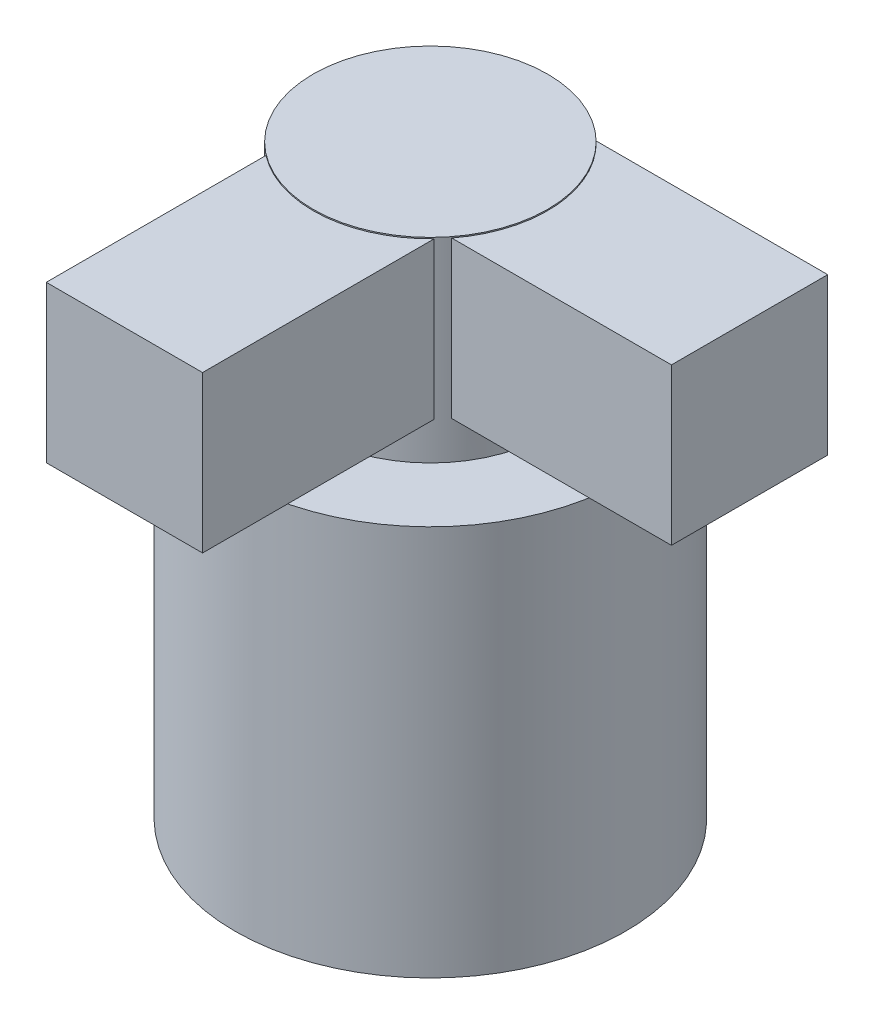
ISO-10303-21;
HEADER;
FILE_DESCRIPTION(('STEP AP214'),'2;1');
FILE_NAME('part.step','',(''),(''),'','','');
FILE_SCHEMA(('AUTOMOTIVE_DESIGN { 1 0 10303 214 1 1 1 1 }'));
ENDSEC;
DATA;
#1=APPLICATION_CONTEXT('core data for automotive mechanical design processes');
#2=APPLICATION_PROTOCOL_DEFINITION('international standard','automotive_design',2000,#1);
#3=PRODUCT_CONTEXT('',#1,'mechanical');
#4=PRODUCT('Part','Part','',(#3));
#5=PRODUCT_RELATED_PRODUCT_CATEGORY('part','',(#4));
#6=PRODUCT_DEFINITION_FORMATION('','',#4);
#7=PRODUCT_DEFINITION_CONTEXT('part definition',#1,'design');
#8=PRODUCT_DEFINITION('design','',#6,#7);
#9=PRODUCT_DEFINITION_SHAPE('','',#8);
#10=(LENGTH_UNIT() NAMED_UNIT(*) SI_UNIT(.MILLI.,.METRE.));
#11=(NAMED_UNIT(*) PLANE_ANGLE_UNIT() SI_UNIT($,.RADIAN.));
#12=(NAMED_UNIT(*) SI_UNIT($,.STERADIAN.) SOLID_ANGLE_UNIT());
#13=UNCERTAINTY_MEASURE_WITH_UNIT(LENGTH_MEASURE(1.E-05),#10,'distance_accuracy_value','');
#14=(GEOMETRIC_REPRESENTATION_CONTEXT(3) GLOBAL_UNCERTAINTY_ASSIGNED_CONTEXT((#13)) GLOBAL_UNIT_ASSIGNED_CONTEXT((#10,
#11,#12)) REPRESENTATION_CONTEXT('',''));
#15=CARTESIAN_POINT('',(0.,0.,0.));
#16=DIRECTION('',(0.,0.,1.));
#17=DIRECTION('',(1.,0.,0.));
#18=AXIS2_PLACEMENT_3D('',#15,#16,#17);
#19=CARTESIAN_POINT('',(0.,15.,0.));
#20=DIRECTION('',(0.,-1.,0.));
#21=DIRECTION('',(0.,0.,-1.));
#22=AXIS2_PLACEMENT_3D('',#19,#20,#21);
#23=CYLINDRICAL_SURFACE('',#22,3.);
#24=DIRECTION('',(0.,-1.,0.));
#25=VECTOR('',#24,1.);
#26=CARTESIAN_POINT('',(-1.83034860686826,15.,2.37693583786678));
#27=LINE('',#26,#25);
#28=CARTESIAN_POINT('',(-1.83034860686826,14.969101694045,2.37693583786678));
#29=VERTEX_POINT('',#28);
#30=CARTESIAN_POINT('',(-1.83034860686826,10.969101694045,2.37693583786678));
#31=VERTEX_POINT('',#30);
#32=EDGE_CURVE('E11',#29,#31,#27,.T.);
#33=ORIENTED_EDGE('',*,*,#32,.F.);
#34=CARTESIAN_POINT('',(0.,14.969101694045,0.));
#35=DIRECTION('',(0.,-1.,0.));
#36=DIRECTION('',(0.,0.,-1.));
#37=AXIS2_PLACEMENT_3D('',#34,#35,#36);
#38=CIRCLE('',#37,3.);
#39=CARTESIAN_POINT('',(2.16965139313174,14.969101694045,2.07186216536754));
#40=VERTEX_POINT('',#39);
#41=EDGE_CURVE('E159',#40,#29,#38,.T.);
#42=ORIENTED_EDGE('',*,*,#41,.F.);
#43=DIRECTION('',(0.,-1.,0.));
#44=VECTOR('',#43,1.);
#45=CARTESIAN_POINT('',(2.16965139313174,15.,2.07186216536754));
#46=LINE('',#45,#44);
#47=CARTESIAN_POINT('',(2.16965139313174,10.969101694045,2.07186216536754));
#48=VERTEX_POINT('',#47);
#49=EDGE_CURVE('E167',#48,#40,#46,.F.);
#50=ORIENTED_EDGE('',*,*,#49,.F.);
#51=CARTESIAN_POINT('',(0.,10.969101694045,0.));
#52=DIRECTION('',(0.,1.,0.));
#53=DIRECTION('',(0.,0.,1.));
#54=AXIS2_PLACEMENT_3D('',#51,#52,#53);
#55=CIRCLE('',#54,3.);
#56=EDGE_CURVE('E41',#31,#48,#55,.T.);
#57=ORIENTED_EDGE('',*,*,#56,.F.);
#58=EDGE_LOOP('',(#33,#42,#50,#57));
#59=FACE_BOUND('',#58,.T.);
#60=CARTESIAN_POINT('',(0.,15.,0.));
#61=DIRECTION('',(0.,1.,0.));
#62=DIRECTION('',(0.,0.,1.));
#63=AXIS2_PLACEMENT_3D('',#60,#61,#62);
#64=CIRCLE('',#63,3.);
#65=CARTESIAN_POINT('',(0.,15.,3.));
#66=VERTEX_POINT('',#65);
#67=EDGE_CURVE('E150',#66,#66,#64,.T.);
#68=ORIENTED_EDGE('',*,*,#67,.F.);
#69=EDGE_LOOP('',(#68));
#70=FACE_BOUND('',#69,.T.);
#71=CARTESIAN_POINT('',(0.,10.,0.));
#72=DIRECTION('',(0.,1.,0.));
#73=DIRECTION('',(0.,0.,1.));
#74=AXIS2_PLACEMENT_3D('',#71,#72,#73);
#75=CIRCLE('',#74,3.);
#76=CARTESIAN_POINT('',(0.,10.,3.));
#77=VERTEX_POINT('',#76);
#78=EDGE_CURVE('E156',#77,#77,#75,.T.);
#79=ORIENTED_EDGE('',*,*,#78,.T.);
#80=EDGE_LOOP('',(#79));
#81=FACE_BOUND('',#80,.T.);
#82=DIRECTION('',(0.,-1.,0.));
#83=VECTOR('',#82,1.);
#84=CARTESIAN_POINT('',(2.37693583786678,15.,1.83034860686825));
#85=LINE('',#84,#83);
#86=CARTESIAN_POINT('',(2.37693583786678,14.969101694045,1.83034860686825));
#87=VERTEX_POINT('',#86);
#88=CARTESIAN_POINT('',(2.37693583786678,10.969101694045,1.83034860686825));
#89=VERTEX_POINT('',#88);
#90=EDGE_CURVE('E118',#87,#89,#85,.T.);
#91=ORIENTED_EDGE('',*,*,#90,.F.);
#92=CARTESIAN_POINT('',(0.,14.969101694045,0.));
#93=DIRECTION('',(0.,-1.,0.));
#94=DIRECTION('',(-1.,0.,0.));
#95=AXIS2_PLACEMENT_3D('',#92,#93,#94);
#96=CIRCLE('',#95,3.);
#97=CARTESIAN_POINT('',(2.07186216536754,14.969101694045,-2.16965139313175));
#98=VERTEX_POINT('',#97);
#99=EDGE_CURVE('E107',#98,#87,#96,.T.);
#100=ORIENTED_EDGE('',*,*,#99,.F.);
#101=DIRECTION('',(0.,-1.,0.));
#102=VECTOR('',#101,1.);
#103=CARTESIAN_POINT('',(2.07186216536754,15.,-2.16965139313175));
#104=LINE('',#103,#102);
#105=CARTESIAN_POINT('',(2.07186216536754,10.969101694045,-2.16965139313175));
#106=VERTEX_POINT('',#105);
#107=EDGE_CURVE('E53',#106,#98,#104,.F.);
#108=ORIENTED_EDGE('',*,*,#107,.F.);
#109=CARTESIAN_POINT('',(0.,10.969101694045,0.));
#110=DIRECTION('',(0.,1.,0.));
#111=DIRECTION('',(1.,0.,0.));
#112=AXIS2_PLACEMENT_3D('',#109,#110,#111);
#113=CIRCLE('',#112,3.);
#114=EDGE_CURVE('E48',#89,#106,#113,.T.);
#115=ORIENTED_EDGE('',*,*,#114,.F.);
#116=EDGE_LOOP('',(#91,#100,#108,#115));
#117=FACE_BOUND('',#116,.T.);
#118=ADVANCED_FACE('F33',(#59,#70,#81,#117),#23,.T.);
#119=CARTESIAN_POINT('',(0.,10.,0.));
#120=DIRECTION('',(0.,-1.,0.));
#121=DIRECTION('',(0.,0.,-1.));
#122=AXIS2_PLACEMENT_3D('',#119,#120,#121);
#123=CYLINDRICAL_SURFACE('',#122,5.);
#124=CARTESIAN_POINT('',(0.,10.,0.));
#125=DIRECTION('',(0.,1.,0.));
#126=DIRECTION('',(0.,0.,1.));
#127=AXIS2_PLACEMENT_3D('',#124,#125,#126);
#128=CIRCLE('',#127,5.);
#129=CARTESIAN_POINT('',(0.,10.,5.));
#130=VERTEX_POINT('',#129);
#131=EDGE_CURVE('E160',#130,#130,#128,.T.);
#132=ORIENTED_EDGE('',*,*,#131,.F.);
#133=EDGE_LOOP('',(#132));
#134=FACE_BOUND('',#133,.T.);
#135=CARTESIAN_POINT('',(0.,0.,0.));
#136=DIRECTION('',(0.,1.,0.));
#137=DIRECTION('',(0.,0.,1.));
#138=AXIS2_PLACEMENT_3D('',#135,#136,#137);
#139=CIRCLE('',#138,5.);
#140=CARTESIAN_POINT('',(0.,0.,5.));
#141=VERTEX_POINT('',#140);
#142=EDGE_CURVE('E155',#141,#141,#139,.T.);
#143=ORIENTED_EDGE('',*,*,#142,.T.);
#144=EDGE_LOOP('',(#143));
#145=FACE_BOUND('',#144,.T.);
#146=ADVANCED_FACE('F35',(#134,#145),#123,.T.);
#147=CARTESIAN_POINT('',(0.,10.,0.));
#148=DIRECTION('',(0.,1.,0.));
#149=DIRECTION('',(0.,0.,1.));
#150=AXIS2_PLACEMENT_3D('',#147,#148,#149);
#151=PLANE('',#150);
#152=ORIENTED_EDGE('',*,*,#78,.F.);
#153=EDGE_LOOP('',(#152));
#154=FACE_BOUND('',#153,.T.);
#155=ORIENTED_EDGE('',*,*,#131,.T.);
#156=EDGE_LOOP('',(#155));
#157=FACE_BOUND('',#156,.T.);
#158=ADVANCED_FACE('F203',(#154,#157),#151,.T.);
#159=CARTESIAN_POINT('',(0.,0.,0.));
#160=DIRECTION('',(0.,1.,0.));
#161=DIRECTION('',(0.,0.,1.));
#162=AXIS2_PLACEMENT_3D('',#159,#160,#161);
#163=PLANE('',#162);
#164=CARTESIAN_POINT('',(0.,0.,0.));
#165=DIRECTION('',(0.,-1.,0.));
#166=DIRECTION('',(0.,0.,-1.));
#167=AXIS2_PLACEMENT_3D('',#164,#165,#166);
#168=CIRCLE('',#167,3.);
#169=CARTESIAN_POINT('',(0.,0.,-3.));
#170=VERTEX_POINT('',#169);
#171=EDGE_CURVE('E146',#170,#170,#168,.T.);
#172=ORIENTED_EDGE('',*,*,#171,.F.);
#173=EDGE_LOOP('',(#172));
#174=FACE_BOUND('',#173,.T.);
#175=ORIENTED_EDGE('',*,*,#142,.F.);
#176=EDGE_LOOP('',(#175));
#177=FACE_BOUND('',#176,.T.);
#178=ADVANCED_FACE('F210',(#174,#177),#163,.F.);
#179=CARTESIAN_POINT('',(0.,15.,0.));
#180=DIRECTION('',(0.,1.,0.));
#181=DIRECTION('',(0.,0.,1.));
#182=AXIS2_PLACEMENT_3D('',#179,#180,#181);
#183=PLANE('',#182);
#184=ORIENTED_EDGE('',*,*,#67,.T.);
#185=EDGE_LOOP('',(#184));
#186=FACE_BOUND('',#185,.T.);
#187=ADVANCED_FACE('F207',(#186),#183,.T.);
#188=CARTESIAN_POINT('',(0.,5.,0.));
#189=DIRECTION('',(0.,-1.,0.));
#190=DIRECTION('',(0.,0.,-1.));
#191=AXIS2_PLACEMENT_3D('',#188,#189,#190);
#192=CYLINDRICAL_SURFACE('',#191,3.);
#193=CARTESIAN_POINT('',(0.,5.,0.));
#194=DIRECTION('',(0.,-1.,0.));
#195=DIRECTION('',(0.,0.,-1.));
#196=AXIS2_PLACEMENT_3D('',#193,#194,#195);
#197=CIRCLE('',#196,3.);
#198=CARTESIAN_POINT('',(0.,5.,-3.));
#199=VERTEX_POINT('',#198);
#200=EDGE_CURVE('E147',#199,#199,#197,.T.);
#201=ORIENTED_EDGE('',*,*,#200,.F.);
#202=EDGE_LOOP('',(#201));
#203=FACE_BOUND('',#202,.T.);
#204=ORIENTED_EDGE('',*,*,#171,.T.);
#205=EDGE_LOOP('',(#204));
#206=FACE_BOUND('',#205,.T.);
#207=ADVANCED_FACE('F217',(#203,#206),#192,.F.);
#208=CARTESIAN_POINT('',(0.,5.,0.));
#209=DIRECTION('',(0.,-1.,0.));
#210=DIRECTION('',(0.,0.,-1.));
#211=AXIS2_PLACEMENT_3D('',#208,#209,#210);
#212=PLANE('',#211);
#213=ORIENTED_EDGE('',*,*,#200,.T.);
#214=EDGE_LOOP('',(#213));
#215=FACE_BOUND('',#214,.T.);
#216=ADVANCED_FACE('F225',(#215),#212,.T.);
#217=CARTESIAN_POINT('',(-1.83034860686826,10.969101694045,8.));
#218=DIRECTION('',(1.,0.,0.));
#219=DIRECTION('',(0.,0.,-1.));
#220=AXIS2_PLACEMENT_3D('',#217,#218,#219);
#221=PLANE('',#220);
#222=DIRECTION('',(0.,0.,-1.));
#223=VECTOR('',#222,1.);
#224=CARTESIAN_POINT('',(-1.83034860686826,14.969101694045,8.));
#225=LINE('',#224,#223);
#226=CARTESIAN_POINT('',(-1.83034860686826,14.969101694045,8.));
#227=VERTEX_POINT('',#226);
#228=EDGE_CURVE('E134',#227,#29,#225,.T.);
#229=ORIENTED_EDGE('',*,*,#228,.T.);
#230=ORIENTED_EDGE('',*,*,#32,.T.);
#231=DIRECTION('',(0.,0.,-1.));
#232=VECTOR('',#231,1.);
#233=CARTESIAN_POINT('',(-1.83034860686826,10.969101694045,8.));
#234=LINE('',#233,#232);
#235=CARTESIAN_POINT('',(-1.83034860686826,10.969101694045,8.));
#236=VERTEX_POINT('',#235);
#237=EDGE_CURVE('E143',#236,#31,#234,.T.);
#238=ORIENTED_EDGE('',*,*,#237,.F.);
#239=DIRECTION('',(0.,-1.,0.));
#240=VECTOR('',#239,1.);
#241=CARTESIAN_POINT('',(-1.83034860686826,10.969101694045,8.));
#242=LINE('',#241,#240);
#243=EDGE_CURVE('E125',#227,#236,#242,.T.);
#244=ORIENTED_EDGE('',*,*,#243,.F.);
#245=EDGE_LOOP('',(#229,#230,#238,#244));
#246=FACE_BOUND('',#245,.T.);
#247=ADVANCED_FACE('F185',(#246),#221,.F.);
#248=CARTESIAN_POINT('',(2.16965139313174,10.969101694045,8.));
#249=DIRECTION('',(-1.,0.,0.));
#250=DIRECTION('',(0.,0.,1.));
#251=AXIS2_PLACEMENT_3D('',#248,#249,#250);
#252=PLANE('',#251);
#253=DIRECTION('',(0.,0.,-1.));
#254=VECTOR('',#253,1.);
#255=CARTESIAN_POINT('',(2.16965139313174,10.969101694045,8.));
#256=LINE('',#255,#254);
#257=CARTESIAN_POINT('',(2.16965139313174,10.969101694045,8.));
#258=VERTEX_POINT('',#257);
#259=EDGE_CURVE('E140',#258,#48,#256,.T.);
#260=ORIENTED_EDGE('',*,*,#259,.T.);
#261=ORIENTED_EDGE('',*,*,#49,.T.);
#262=DIRECTION('',(0.,0.,-1.));
#263=VECTOR('',#262,1.);
#264=CARTESIAN_POINT('',(2.16965139313174,14.969101694045,8.));
#265=LINE('',#264,#263);
#266=CARTESIAN_POINT('',(2.16965139313174,14.969101694045,8.));
#267=VERTEX_POINT('',#266);
#268=EDGE_CURVE('E137',#267,#40,#265,.T.);
#269=ORIENTED_EDGE('',*,*,#268,.F.);
#270=DIRECTION('',(0.,1.,0.));
#271=VECTOR('',#270,1.);
#272=CARTESIAN_POINT('',(2.16965139313174,10.969101694045,8.));
#273=LINE('',#272,#271);
#274=EDGE_CURVE('E130',#258,#267,#273,.T.);
#275=ORIENTED_EDGE('',*,*,#274,.F.);
#276=EDGE_LOOP('',(#260,#261,#269,#275));
#277=FACE_BOUND('',#276,.T.);
#278=ADVANCED_FACE('F177',(#277),#252,.F.);
#279=CARTESIAN_POINT('',(2.16965139313174,10.969101694045,8.));
#280=DIRECTION('',(0.,1.,0.));
#281=DIRECTION('',(0.,0.,1.));
#282=AXIS2_PLACEMENT_3D('',#279,#280,#281);
#283=PLANE('',#282);
#284=ORIENTED_EDGE('',*,*,#237,.T.);
#285=ORIENTED_EDGE('',*,*,#56,.T.);
#286=ORIENTED_EDGE('',*,*,#259,.F.);
#287=DIRECTION('',(1.,0.,0.));
#288=VECTOR('',#287,1.);
#289=CARTESIAN_POINT('',(2.16965139313174,10.969101694045,8.));
#290=LINE('',#289,#288);
#291=EDGE_CURVE('E128',#236,#258,#290,.T.);
#292=ORIENTED_EDGE('',*,*,#291,.F.);
#293=EDGE_LOOP('',(#284,#285,#286,#292));
#294=FACE_BOUND('',#293,.T.);
#295=ADVANCED_FACE('F172',(#294),#283,.F.);
#296=CARTESIAN_POINT('',(2.16965139313174,14.969101694045,8.));
#297=DIRECTION('',(0.,-1.,0.));
#298=DIRECTION('',(0.,0.,-1.));
#299=AXIS2_PLACEMENT_3D('',#296,#297,#298);
#300=PLANE('',#299);
#301=ORIENTED_EDGE('',*,*,#268,.T.);
#302=ORIENTED_EDGE('',*,*,#41,.T.);
#303=ORIENTED_EDGE('',*,*,#228,.F.);
#304=DIRECTION('',(-1.,0.,0.));
#305=VECTOR('',#304,1.);
#306=CARTESIAN_POINT('',(2.16965139313174,14.969101694045,8.));
#307=LINE('',#306,#305);
#308=EDGE_CURVE('E132',#267,#227,#307,.T.);
#309=ORIENTED_EDGE('',*,*,#308,.F.);
#310=EDGE_LOOP('',(#301,#302,#303,#309));
#311=FACE_BOUND('',#310,.T.);
#312=ADVANCED_FACE('F188',(#311),#300,.F.);
#313=CARTESIAN_POINT('',(0.,0.,8.));
#314=DIRECTION('',(0.,0.,1.));
#315=DIRECTION('',(1.,0.,0.));
#316=AXIS2_PLACEMENT_3D('',#313,#314,#315);
#317=PLANE('',#316);
#318=ORIENTED_EDGE('',*,*,#243,.T.);
#319=ORIENTED_EDGE('',*,*,#291,.T.);
#320=ORIENTED_EDGE('',*,*,#274,.T.);
#321=ORIENTED_EDGE('',*,*,#308,.T.);
#322=EDGE_LOOP('',(#318,#319,#320,#321));
#323=FACE_BOUND('',#322,.T.);
#324=ADVANCED_FACE('F181',(#323),#317,.T.);
#325=CARTESIAN_POINT('',(8.00000000000001,10.969101694045,1.83034860686823));
#326=DIRECTION('',(0.,0.,-1.));
#327=DIRECTION('',(-1.,0.,0.));
#328=AXIS2_PLACEMENT_3D('',#325,#326,#327);
#329=PLANE('',#328);
#330=DIRECTION('',(-1.,0.,0.));
#331=VECTOR('',#330,1.);
#332=CARTESIAN_POINT('',(8.00000000000001,14.969101694045,1.83034860686823));
#333=LINE('',#332,#331);
#334=CARTESIAN_POINT('',(8.00000000000001,14.969101694045,1.83034860686823));
#335=VERTEX_POINT('',#334);
#336=EDGE_CURVE('E310',#335,#87,#333,.T.);
#337=ORIENTED_EDGE('',*,*,#336,.T.);
#338=ORIENTED_EDGE('',*,*,#90,.T.);
#339=DIRECTION('',(-1.,0.,0.));
#340=VECTOR('',#339,1.);
#341=CARTESIAN_POINT('',(8.00000000000001,10.969101694045,1.83034860686823));
#342=LINE('',#341,#340);
#343=CARTESIAN_POINT('',(8.00000000000001,10.969101694045,1.83034860686823));
#344=VERTEX_POINT('',#343);
#345=EDGE_CURVE('E112',#344,#89,#342,.T.);
#346=ORIENTED_EDGE('',*,*,#345,.F.);
#347=DIRECTION('',(0.,-1.,0.));
#348=VECTOR('',#347,1.);
#349=CARTESIAN_POINT('',(8.00000000000001,10.969101694045,1.83034860686823));
#350=LINE('',#349,#348);
#351=EDGE_CURVE('E96',#335,#344,#350,.T.);
#352=ORIENTED_EDGE('',*,*,#351,.F.);
#353=EDGE_LOOP('',(#337,#338,#346,#352));
#354=FACE_BOUND('',#353,.T.);
#355=ADVANCED_FACE('F117',(#354),#329,.F.);
#356=CARTESIAN_POINT('',(7.99999999999999,10.969101694045,-2.16965139313177));
#357=DIRECTION('',(0.,1.,0.));
#358=DIRECTION('',(1.,0.,0.));
#359=AXIS2_PLACEMENT_3D('',#356,#357,#358);
#360=PLANE('',#359);
#361=ORIENTED_EDGE('',*,*,#345,.T.);
#362=ORIENTED_EDGE('',*,*,#114,.T.);
#363=DIRECTION('',(-1.,0.,0.));
#364=VECTOR('',#363,1.);
#365=CARTESIAN_POINT('',(7.99999999999999,10.969101694045,-2.16965139313177));
#366=LINE('',#365,#364);
#367=CARTESIAN_POINT('',(7.99999999999999,10.969101694045,-2.16965139313177));
#368=VERTEX_POINT('',#367);
#369=EDGE_CURVE('E114',#368,#106,#366,.T.);
#370=ORIENTED_EDGE('',*,*,#369,.F.);
#371=DIRECTION('',(0.,0.,-1.));
#372=VECTOR('',#371,1.);
#373=CARTESIAN_POINT('',(7.99999999999999,10.969101694045,-2.16965139313177));
#374=LINE('',#373,#372);
#375=EDGE_CURVE('E99',#344,#368,#374,.T.);
#376=ORIENTED_EDGE('',*,*,#375,.F.);
#377=EDGE_LOOP('',(#361,#362,#370,#376));
#378=FACE_BOUND('',#377,.T.);
#379=ADVANCED_FACE('F111',(#378),#360,.F.);
#380=CARTESIAN_POINT('',(7.99999999999999,10.969101694045,-2.16965139313177));
#381=DIRECTION('',(0.,0.,1.));
#382=DIRECTION('',(1.,0.,0.));
#383=AXIS2_PLACEMENT_3D('',#380,#381,#382);
#384=PLANE('',#383);
#385=ORIENTED_EDGE('',*,*,#369,.T.);
#386=ORIENTED_EDGE('',*,*,#107,.T.);
#387=DIRECTION('',(-1.,0.,0.));
#388=VECTOR('',#387,1.);
#389=CARTESIAN_POINT('',(7.99999999999999,14.969101694045,-2.16965139313177));
#390=LINE('',#389,#388);
#391=CARTESIAN_POINT('',(7.99999999999999,14.969101694045,-2.16965139313177));
#392=VERTEX_POINT('',#391);
#393=EDGE_CURVE('E309',#392,#98,#390,.T.);
#394=ORIENTED_EDGE('',*,*,#393,.F.);
#395=DIRECTION('',(0.,1.,0.));
#396=VECTOR('',#395,1.);
#397=CARTESIAN_POINT('',(7.99999999999999,10.969101694045,-2.16965139313177));
#398=LINE('',#397,#396);
#399=EDGE_CURVE('E115',#368,#392,#398,.T.);
#400=ORIENTED_EDGE('',*,*,#399,.F.);
#401=EDGE_LOOP('',(#385,#386,#394,#400));
#402=FACE_BOUND('',#401,.T.);
#403=ADVANCED_FACE('F275',(#402),#384,.F.);
#404=CARTESIAN_POINT('',(7.99999999999999,14.969101694045,-2.16965139313177));
#405=DIRECTION('',(0.,-1.,0.));
#406=DIRECTION('',(-1.,0.,0.));
#407=AXIS2_PLACEMENT_3D('',#404,#405,#406);
#408=PLANE('',#407);
#409=ORIENTED_EDGE('',*,*,#393,.T.);
#410=ORIENTED_EDGE('',*,*,#99,.T.);
#411=ORIENTED_EDGE('',*,*,#336,.F.);
#412=DIRECTION('',(0.,0.,1.));
#413=VECTOR('',#412,1.);
#414=CARTESIAN_POINT('',(7.99999999999999,14.969101694045,-2.16965139313177));
#415=LINE('',#414,#413);
#416=EDGE_CURVE('E102',#392,#335,#415,.T.);
#417=ORIENTED_EDGE('',*,*,#416,.F.);
#418=EDGE_LOOP('',(#409,#410,#411,#417));
#419=FACE_BOUND('',#418,.T.);
#420=ADVANCED_FACE('F284',(#419),#408,.F.);
#421=CARTESIAN_POINT('',(8.,0.,0.));
#422=DIRECTION('',(1.,0.,0.));
#423=DIRECTION('',(0.,0.,-1.));
#424=AXIS2_PLACEMENT_3D('',#421,#422,#423);
#425=PLANE('',#424);
#426=ORIENTED_EDGE('',*,*,#351,.T.);
#427=ORIENTED_EDGE('',*,*,#375,.T.);
#428=ORIENTED_EDGE('',*,*,#399,.T.);
#429=ORIENTED_EDGE('',*,*,#416,.T.);
#430=EDGE_LOOP('',(#426,#427,#428,#429));
#431=FACE_BOUND('',#430,.T.);
#432=ADVANCED_FACE('F98',(#431),#425,.T.);
#433=CLOSED_SHELL('',(#118,#146,#158,#178,#187,#207,#216,#247,#278,#295,#312,#324,#355,#379,
#403,#420,#432));
#434=MANIFOLD_SOLID_BREP('B2',#433);
#435=ADVANCED_BREP_SHAPE_REPRESENTATION('',(#18,#434),#14);
#436=SHAPE_DEFINITION_REPRESENTATION(#9,#435);
ENDSEC;
END-ISO-10303-21;
